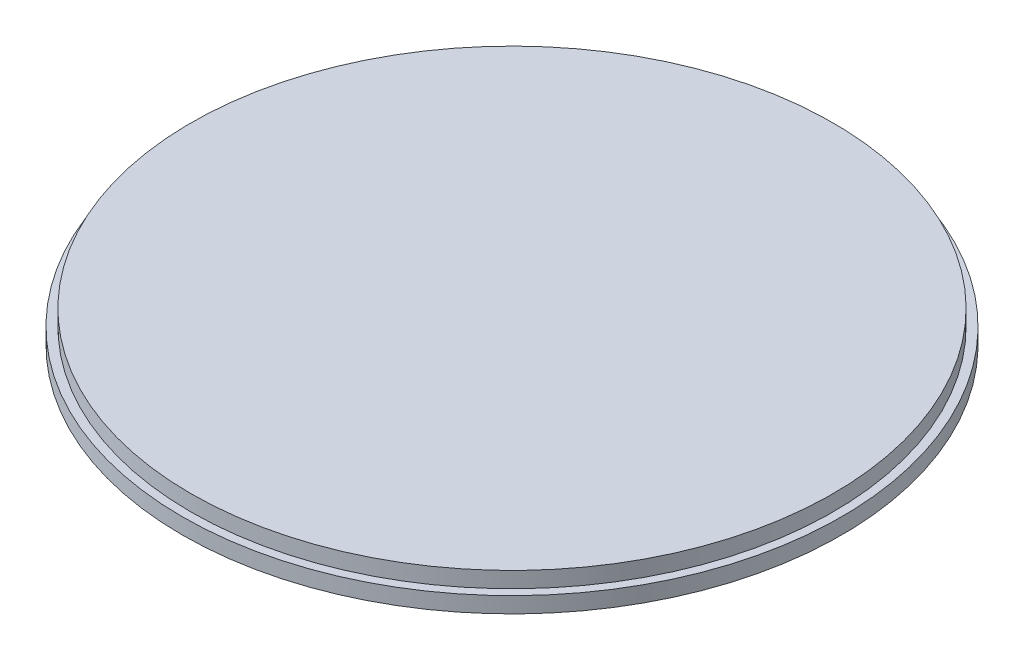
ISO-10303-21;
HEADER;
FILE_DESCRIPTION(('STEP AP214'),'2;1');
FILE_NAME('part.step','',(''),(''),'','','');
FILE_SCHEMA(('AUTOMOTIVE_DESIGN { 1 0 10303 214 1 1 1 1 }'));
ENDSEC;
DATA;
#1=APPLICATION_CONTEXT('core data for automotive mechanical design processes');
#2=APPLICATION_PROTOCOL_DEFINITION('international standard','automotive_design',2000,#1);
#3=PRODUCT_CONTEXT('',#1,'mechanical');
#4=PRODUCT('Part','Part','',(#3));
#5=PRODUCT_RELATED_PRODUCT_CATEGORY('part','',(#4));
#6=PRODUCT_DEFINITION_FORMATION('','',#4);
#7=PRODUCT_DEFINITION_CONTEXT('part definition',#1,'design');
#8=PRODUCT_DEFINITION('design','',#6,#7);
#9=PRODUCT_DEFINITION_SHAPE('','',#8);
#10=(LENGTH_UNIT() NAMED_UNIT(*) SI_UNIT(.MILLI.,.METRE.));
#11=(NAMED_UNIT(*) PLANE_ANGLE_UNIT() SI_UNIT($,.RADIAN.));
#12=(NAMED_UNIT(*) SI_UNIT($,.STERADIAN.) SOLID_ANGLE_UNIT());
#13=UNCERTAINTY_MEASURE_WITH_UNIT(LENGTH_MEASURE(1.E-05),#10,'distance_accuracy_value','');
#14=(GEOMETRIC_REPRESENTATION_CONTEXT(3) GLOBAL_UNCERTAINTY_ASSIGNED_CONTEXT((#13)) GLOBAL_UNIT_ASSIGNED_CONTEXT((#10,
#11,#12)) REPRESENTATION_CONTEXT('',''));
#15=CARTESIAN_POINT('',(0.,0.,0.));
#16=DIRECTION('',(0.,0.,1.));
#17=DIRECTION('',(1.,0.,0.));
#18=AXIS2_PLACEMENT_3D('',#15,#16,#17);
#19=CARTESIAN_POINT('',(0.,0.,0.));
#20=DIRECTION('',(0.,1.,0.));
#21=DIRECTION('',(0.,0.,1.));
#22=AXIS2_PLACEMENT_3D('',#19,#20,#21);
#23=PLANE('',#22);
#24=CARTESIAN_POINT('',(0.,0.,0.));
#25=DIRECTION('',(0.,1.,0.));
#26=DIRECTION('',(0.,0.,1.));
#27=AXIS2_PLACEMENT_3D('',#24,#25,#26);
#28=CIRCLE('',#27,49.53);
#29=CARTESIAN_POINT('',(0.,0.,49.53));
#30=VERTEX_POINT('',#29);
#31=EDGE_CURVE('E10',#30,#30,#28,.T.);
#32=ORIENTED_EDGE('',*,*,#31,.F.);
#33=EDGE_LOOP('',(#32));
#34=FACE_BOUND('',#33,.T.);
#35=ADVANCED_FACE('F31',(#34),#23,.F.);
#36=CARTESIAN_POINT('',(0.,4.76249999999999,0.));
#37=DIRECTION('',(0.,1.,0.));
#38=DIRECTION('',(0.,0.,1.));
#39=AXIS2_PLACEMENT_3D('',#36,#37,#38);
#40=CYLINDRICAL_SURFACE('',#39,49.53);
#41=CARTESIAN_POINT('',(0.,2.38125,0.));
#42=DIRECTION('',(0.,1.,0.));
#43=DIRECTION('',(0.,0.,1.));
#44=AXIS2_PLACEMENT_3D('',#41,#42,#43);
#45=CIRCLE('',#44,49.53);
#46=CARTESIAN_POINT('',(0.,2.38125,49.53));
#47=VERTEX_POINT('',#46);
#48=EDGE_CURVE('E37',#47,#47,#45,.T.);
#49=ORIENTED_EDGE('',*,*,#48,.F.);
#50=EDGE_LOOP('',(#49));
#51=FACE_BOUND('',#50,.T.);
#52=ORIENTED_EDGE('',*,*,#31,.T.);
#53=EDGE_LOOP('',(#52));
#54=FACE_BOUND('',#53,.T.);
#55=ADVANCED_FACE('F61',(#51,#54),#40,.T.);
#56=CARTESIAN_POINT('',(49.53,2.38125,0.));
#57=DIRECTION('',(0.,-1.,0.));
#58=DIRECTION('',(0.,0.,-1.));
#59=AXIS2_PLACEMENT_3D('',#56,#57,#58);
#60=PLANE('',#59);
#61=CARTESIAN_POINT('',(0.,2.38125,0.));
#62=DIRECTION('',(0.,1.,0.));
#63=DIRECTION('',(0.,0.,1.));
#64=AXIS2_PLACEMENT_3D('',#61,#62,#63);
#65=CIRCLE('',#64,48.26);
#66=CARTESIAN_POINT('',(0.,2.38125,48.26));
#67=VERTEX_POINT('',#66);
#68=EDGE_CURVE('E41',#67,#67,#65,.T.);
#69=ORIENTED_EDGE('',*,*,#68,.F.);
#70=EDGE_LOOP('',(#69));
#71=FACE_BOUND('',#70,.T.);
#72=ORIENTED_EDGE('',*,*,#48,.T.);
#73=EDGE_LOOP('',(#72));
#74=FACE_BOUND('',#73,.T.);
#75=ADVANCED_FACE('F56',(#71,#74),#60,.F.);
#76=CARTESIAN_POINT('',(0.,4.76249999999999,0.));
#77=DIRECTION('',(0.,1.,0.));
#78=DIRECTION('',(0.,0.,1.));
#79=AXIS2_PLACEMENT_3D('',#76,#77,#78);
#80=CYLINDRICAL_SURFACE('',#79,48.26);
#81=CARTESIAN_POINT('',(0.,4.7625,0.));
#82=DIRECTION('',(0.,1.,0.));
#83=DIRECTION('',(0.,0.,1.));
#84=AXIS2_PLACEMENT_3D('',#81,#82,#83);
#85=CIRCLE('',#84,48.26);
#86=CARTESIAN_POINT('',(0.,4.7625,48.26));
#87=VERTEX_POINT('',#86);
#88=EDGE_CURVE('E45',#87,#87,#85,.T.);
#89=ORIENTED_EDGE('',*,*,#88,.F.);
#90=EDGE_LOOP('',(#89));
#91=FACE_BOUND('',#90,.T.);
#92=ORIENTED_EDGE('',*,*,#68,.T.);
#93=EDGE_LOOP('',(#92));
#94=FACE_BOUND('',#93,.T.);
#95=ADVANCED_FACE('F53',(#91,#94),#80,.T.);
#96=CARTESIAN_POINT('',(48.26,4.7625,0.));
#97=DIRECTION('',(0.,-1.,0.));
#98=DIRECTION('',(0.,0.,-1.));
#99=AXIS2_PLACEMENT_3D('',#96,#97,#98);
#100=PLANE('',#99);
#101=ORIENTED_EDGE('',*,*,#88,.T.);
#102=EDGE_LOOP('',(#101));
#103=FACE_BOUND('',#102,.T.);
#104=ADVANCED_FACE('F51',(#103),#100,.F.);
#105=CLOSED_SHELL('',(#35,#55,#75,#95,#104));
#106=MANIFOLD_SOLID_BREP('B2',#105);
#107=ADVANCED_BREP_SHAPE_REPRESENTATION('',(#18,#106),#14);
#108=SHAPE_DEFINITION_REPRESENTATION(#9,#107);
ENDSEC;
END-ISO-10303-21;
